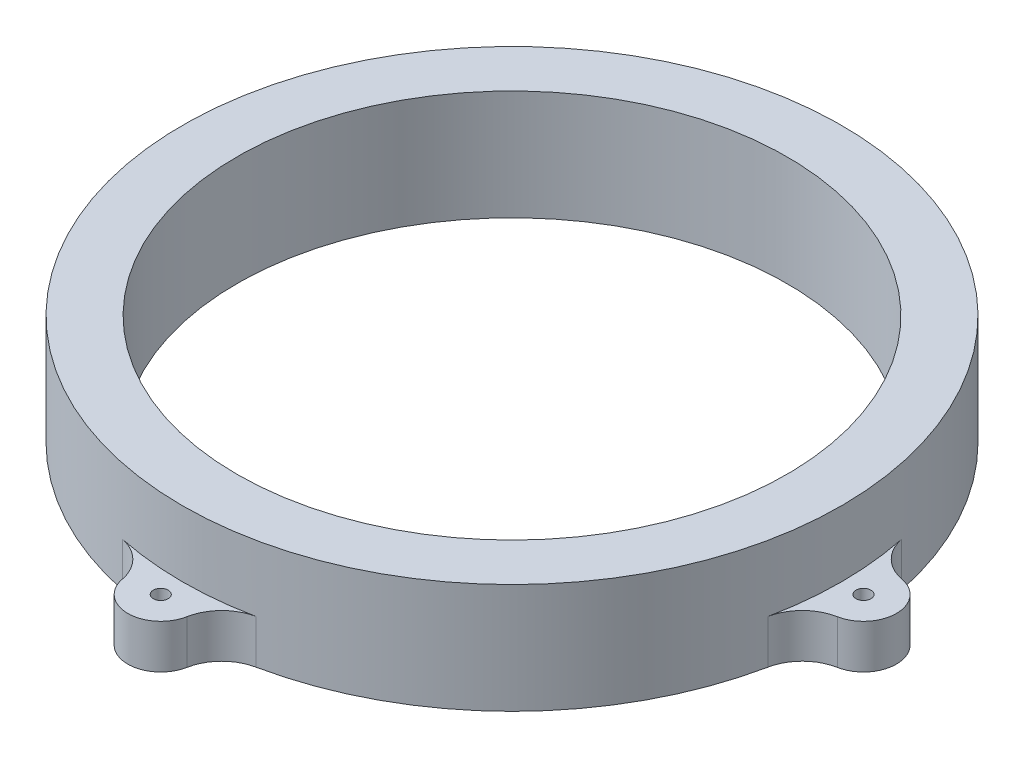
ISO-10303-21;
HEADER;
FILE_DESCRIPTION(('STEP AP214'),'2;1');
FILE_NAME('part.step','',(''),(''),'','','');
FILE_SCHEMA(('AUTOMOTIVE_DESIGN { 1 0 10303 214 1 1 1 1 }'));
ENDSEC;
DATA;
#1=APPLICATION_CONTEXT('core data for automotive mechanical design processes');
#2=APPLICATION_PROTOCOL_DEFINITION('international standard','automotive_design',2000,#1);
#3=PRODUCT_CONTEXT('',#1,'mechanical');
#4=PRODUCT('Part','Part','',(#3));
#5=PRODUCT_RELATED_PRODUCT_CATEGORY('part','',(#4));
#6=PRODUCT_DEFINITION_FORMATION('','',#4);
#7=PRODUCT_DEFINITION_CONTEXT('part definition',#1,'design');
#8=PRODUCT_DEFINITION('design','',#6,#7);
#9=PRODUCT_DEFINITION_SHAPE('','',#8);
#10=(LENGTH_UNIT() NAMED_UNIT(*) SI_UNIT(.MILLI.,.METRE.));
#11=(NAMED_UNIT(*) PLANE_ANGLE_UNIT() SI_UNIT($,.RADIAN.));
#12=(NAMED_UNIT(*) SI_UNIT($,.STERADIAN.) SOLID_ANGLE_UNIT());
#13=UNCERTAINTY_MEASURE_WITH_UNIT(LENGTH_MEASURE(1.E-05),#10,'distance_accuracy_value','');
#14=(GEOMETRIC_REPRESENTATION_CONTEXT(3) GLOBAL_UNCERTAINTY_ASSIGNED_CONTEXT((#13)) GLOBAL_UNIT_ASSIGNED_CONTEXT((#10,
#11,#12)) REPRESENTATION_CONTEXT('',''));
#15=CARTESIAN_POINT('',(0.,0.,0.));
#16=DIRECTION('',(0.,0.,1.));
#17=DIRECTION('',(1.,0.,0.));
#18=AXIS2_PLACEMENT_3D('',#15,#16,#17);
#19=CARTESIAN_POINT('',(0.,10.,0.));
#20=DIRECTION('',(0.,1.,0.));
#21=DIRECTION('',(0.,0.,1.));
#22=AXIS2_PLACEMENT_3D('',#19,#20,#21);
#23=PLANE('',#22);
#24=CARTESIAN_POINT('',(0.,10.,0.));
#25=DIRECTION('',(0.,1.,0.));
#26=DIRECTION('',(0.,0.,1.));
#27=AXIS2_PLACEMENT_3D('',#24,#25,#26);
#28=CIRCLE('',#27,75.);
#29=CARTESIAN_POINT('',(73.454443100662,10.,15.1474350558638));
#30=VERTEX_POINT('',#29);
#31=CARTESIAN_POINT('',(73.445265130853,10.,-15.1918738099914));
#32=VERTEX_POINT('',#31);
#33=EDGE_CURVE('E12',#30,#32,#28,.T.);
#34=ORIENTED_EDGE('',*,*,#33,.F.);
#35=CARTESIAN_POINT('',(83.2483688474169,10.,17.1670930633123));
#36=DIRECTION('',(0.,1.,0.));
#37=DIRECTION('',(0.,0.,1.));
#38=AXIS2_PLACEMENT_3D('',#35,#36,#37);
#39=CIRCLE('',#38,10.);
#40=CARTESIAN_POINT('',(81.3783331926721,10.,7.34350071377011));
#41=VERTEX_POINT('',#40);
#42=EDGE_CURVE('E400',#30,#41,#39,.F.);
#43=ORIENTED_EDGE('',*,*,#42,.T.);
#44=CARTESIAN_POINT('',(79.9758064516135,10.,-0.0241935483865136));
#45=DIRECTION('',(0.,1.,0.));
#46=DIRECTION('',(0.,0.,1.));
#47=AXIS2_PLACEMENT_3D('',#44,#45,#46);
#48=CIRCLE('',#47,7.50000000000001);
#49=CARTESIAN_POINT('',(81.3738753216221,10.,-7.39273502107384));
#50=VERTEX_POINT('',#49);
#51=EDGE_CURVE('E276',#41,#50,#48,.T.);
#52=ORIENTED_EDGE('',*,*,#51,.T.);
#53=CARTESIAN_POINT('',(83.2379671483001,10.,-17.2174569846569));
#54=DIRECTION('',(0.,1.,0.));
#55=DIRECTION('',(0.,0.,1.));
#56=AXIS2_PLACEMENT_3D('',#53,#54,#55);
#57=CIRCLE('',#56,10.);
#58=EDGE_CURVE('E403',#50,#32,#57,.F.);
#59=ORIENTED_EDGE('',*,*,#58,.T.);
#60=EDGE_LOOP('',(#34,#43,#52,#59));
#61=FACE_BOUND('',#60,.T.);
#62=CARTESIAN_POINT('',(79.9758064516135,10.,-0.0241935483865136));
#63=DIRECTION('',(0.,1.,0.));
#64=DIRECTION('',(0.,0.,1.));
#65=AXIS2_PLACEMENT_3D('',#62,#63,#64);
#66=CIRCLE('',#65,1.7);
#67=CARTESIAN_POINT('',(79.9758064516135,10.,1.67580645161349));
#68=VERTEX_POINT('',#67);
#69=EDGE_CURVE('E282',#68,#68,#66,.T.);
#70=ORIENTED_EDGE('',*,*,#69,.F.);
#71=EDGE_LOOP('',(#70));
#72=FACE_BOUND('',#71,.T.);
#73=ADVANCED_FACE('F96',(#61,#72),#23,.T.);
#74=CARTESIAN_POINT('',(15.1738597330543,10.,-73.4489889705883));
#75=VERTEX_POINT('',#74);
#76=CARTESIAN_POINT('',(-15.1738597330543,10.,-73.4489889705883));
#77=VERTEX_POINT('',#76);
#78=EDGE_CURVE('E106',#75,#77,#28,.T.);
#79=ORIENTED_EDGE('',*,*,#78,.F.);
#80=CARTESIAN_POINT('',(17.1970410307949,10.,-83.2421875));
#81=DIRECTION('',(0.,1.,0.));
#82=DIRECTION('',(0.,0.,1.));
#83=AXIS2_PLACEMENT_3D('',#80,#81,#82);
#84=CIRCLE('',#83,10.);
#85=CARTESIAN_POINT('',(7.37016044176925,10.,-81.3895089285714));
#86=VERTEX_POINT('',#85);
#87=EDGE_CURVE('E100',#75,#86,#84,.F.);
#88=ORIENTED_EDGE('',*,*,#87,.T.);
#89=CARTESIAN_POINT('',(0.,10.,-80.));
#90=DIRECTION('',(0.,1.,0.));
#91=DIRECTION('',(0.,0.,1.));
#92=AXIS2_PLACEMENT_3D('',#89,#90,#91);
#93=CIRCLE('',#92,7.5);
#94=CARTESIAN_POINT('',(-7.37016044176925,10.,-81.3895089285714));
#95=VERTEX_POINT('',#94);
#96=EDGE_CURVE('E260',#86,#95,#93,.T.);
#97=ORIENTED_EDGE('',*,*,#96,.T.);
#98=CARTESIAN_POINT('',(-17.1970410307949,10.,-83.2421875));
#99=DIRECTION('',(0.,1.,0.));
#100=DIRECTION('',(0.,0.,1.));
#101=AXIS2_PLACEMENT_3D('',#98,#99,#100);
#102=CIRCLE('',#101,10.);
#103=EDGE_CURVE('E409',#95,#77,#102,.F.);
#104=ORIENTED_EDGE('',*,*,#103,.T.);
#105=EDGE_LOOP('',(#79,#88,#97,#104));
#106=FACE_BOUND('',#105,.T.);
#107=CARTESIAN_POINT('',(0.,10.,-80.));
#108=DIRECTION('',(0.,1.,0.));
#109=DIRECTION('',(0.,0.,1.));
#110=AXIS2_PLACEMENT_3D('',#107,#108,#109);
#111=CIRCLE('',#110,1.69999999999999);
#112=CARTESIAN_POINT('',(0.,10.,-78.3));
#113=VERTEX_POINT('',#112);
#114=EDGE_CURVE('E267',#113,#113,#111,.T.);
#115=ORIENTED_EDGE('',*,*,#114,.F.);
#116=EDGE_LOOP('',(#115));
#117=FACE_BOUND('',#116,.T.);
#118=ADVANCED_FACE('F423',(#106,#117),#23,.T.);
#119=CARTESIAN_POINT('',(-73.445265130853,10.,-15.1918738099914));
#120=VERTEX_POINT('',#119);
#121=CARTESIAN_POINT('',(-73.454443100662,10.,15.1474350558638));
#122=VERTEX_POINT('',#121);
#123=EDGE_CURVE('E247',#120,#122,#28,.T.);
#124=ORIENTED_EDGE('',*,*,#123,.F.);
#125=CARTESIAN_POINT('',(-83.2379671483001,10.,-17.2174569846569));
#126=DIRECTION('',(0.,1.,0.));
#127=DIRECTION('',(0.,0.,1.));
#128=AXIS2_PLACEMENT_3D('',#125,#126,#127);
#129=CIRCLE('',#128,10.);
#130=CARTESIAN_POINT('',(-81.3738753216221,10.,-7.39273502107383));
#131=VERTEX_POINT('',#130);
#132=EDGE_CURVE('E381',#120,#131,#129,.F.);
#133=ORIENTED_EDGE('',*,*,#132,.T.);
#134=CARTESIAN_POINT('',(-79.9758064516135,10.,-0.0241935483865081));
#135=DIRECTION('',(0.,1.,0.));
#136=DIRECTION('',(0.,0.,1.));
#137=AXIS2_PLACEMENT_3D('',#134,#135,#136);
#138=CIRCLE('',#137,7.5);
#139=CARTESIAN_POINT('',(-81.3783331926721,10.,7.34350071377011));
#140=VERTEX_POINT('',#139);
#141=EDGE_CURVE('E306',#131,#140,#138,.T.);
#142=ORIENTED_EDGE('',*,*,#141,.T.);
#143=CARTESIAN_POINT('',(-83.2483688474169,10.,17.1670930633123));
#144=DIRECTION('',(0.,1.,0.));
#145=DIRECTION('',(0.,0.,1.));
#146=AXIS2_PLACEMENT_3D('',#143,#144,#145);
#147=CIRCLE('',#146,10.);
#148=EDGE_CURVE('E384',#140,#122,#147,.F.);
#149=ORIENTED_EDGE('',*,*,#148,.T.);
#150=EDGE_LOOP('',(#124,#133,#142,#149));
#151=FACE_BOUND('',#150,.T.);
#152=CARTESIAN_POINT('',(-79.9758064516135,10.,-0.0241935483865081));
#153=DIRECTION('',(0.,1.,0.));
#154=DIRECTION('',(0.,0.,1.));
#155=AXIS2_PLACEMENT_3D('',#152,#153,#154);
#156=CIRCLE('',#155,1.7);
#157=CARTESIAN_POINT('',(-79.9758064516135,10.,1.67580645161349));
#158=VERTEX_POINT('',#157);
#159=EDGE_CURVE('E312',#158,#158,#156,.T.);
#160=ORIENTED_EDGE('',*,*,#159,.F.);
#161=EDGE_LOOP('',(#160));
#162=FACE_BOUND('',#161,.T.);
#163=ADVANCED_FACE('F465',(#151,#162),#23,.T.);
#164=CARTESIAN_POINT('',(0.,10.,0.));
#165=DIRECTION('',(0.,-1.,0.));
#166=DIRECTION('',(0.,0.,-1.));
#167=AXIS2_PLACEMENT_3D('',#164,#165,#166);
#168=CYLINDRICAL_SURFACE('',#167,62.6);
#169=CARTESIAN_POINT('',(0.,0.,0.));
#170=DIRECTION('',(0.,1.,0.));
#171=DIRECTION('',(0.,0.,1.));
#172=AXIS2_PLACEMENT_3D('',#169,#170,#171);
#173=CIRCLE('',#172,62.6);
#174=CARTESIAN_POINT('',(0.,0.,62.6));
#175=VERTEX_POINT('',#174);
#176=EDGE_CURVE('E255',#175,#175,#173,.T.);
#177=ORIENTED_EDGE('',*,*,#176,.F.);
#178=EDGE_LOOP('',(#177));
#179=FACE_BOUND('',#178,.T.);
#180=CARTESIAN_POINT('',(0.,25.,0.));
#181=DIRECTION('',(0.,1.,0.));
#182=DIRECTION('',(0.,0.,1.));
#183=AXIS2_PLACEMENT_3D('',#180,#181,#182);
#184=CIRCLE('',#183,62.6);
#185=CARTESIAN_POINT('',(0.,25.,62.6));
#186=VERTEX_POINT('',#185);
#187=EDGE_CURVE('E739',#186,#186,#184,.T.);
#188=ORIENTED_EDGE('',*,*,#187,.T.);
#189=EDGE_LOOP('',(#188));
#190=FACE_BOUND('',#189,.T.);
#191=ADVANCED_FACE('F476',(#179,#190),#168,.F.);
#192=CARTESIAN_POINT('',(0.,0.,0.));
#193=DIRECTION('',(0.,1.,0.));
#194=DIRECTION('',(0.,0.,1.));
#195=AXIS2_PLACEMENT_3D('',#192,#193,#194);
#196=PLANE('',#195);
#197=CARTESIAN_POINT('',(0.,0.,0.));
#198=DIRECTION('',(0.,1.,0.));
#199=DIRECTION('',(0.,0.,1.));
#200=AXIS2_PLACEMENT_3D('',#197,#198,#199);
#201=CIRCLE('',#200,75.);
#202=CARTESIAN_POINT('',(-15.1738597330543,0.,-73.4489889705883));
#203=VERTEX_POINT('',#202);
#204=CARTESIAN_POINT('',(-73.445265130853,0.,-15.1918738099914));
#205=VERTEX_POINT('',#204);
#206=EDGE_CURVE('E266',#203,#205,#201,.T.);
#207=ORIENTED_EDGE('',*,*,#206,.F.);
#208=CARTESIAN_POINT('',(-17.1970410307949,0.,-83.2421875));
#209=DIRECTION('',(0.,1.,0.));
#210=DIRECTION('',(0.,0.,1.));
#211=AXIS2_PLACEMENT_3D('',#208,#209,#210);
#212=CIRCLE('',#211,10.);
#213=CARTESIAN_POINT('',(-7.37016044176925,0.,-81.3895089285714));
#214=VERTEX_POINT('',#213);
#215=EDGE_CURVE('E115',#203,#214,#212,.T.);
#216=ORIENTED_EDGE('',*,*,#215,.T.);
#217=CARTESIAN_POINT('',(0.,0.,-80.));
#218=DIRECTION('',(0.,1.,0.));
#219=DIRECTION('',(0.,0.,1.));
#220=AXIS2_PLACEMENT_3D('',#217,#218,#219);
#221=CIRCLE('',#220,7.5);
#222=CARTESIAN_POINT('',(7.37016044176925,0.,-81.3895089285714));
#223=VERTEX_POINT('',#222);
#224=EDGE_CURVE('E271',#223,#214,#221,.T.);
#225=ORIENTED_EDGE('',*,*,#224,.F.);
#226=CARTESIAN_POINT('',(17.1970410307949,0.,-83.2421875));
#227=DIRECTION('',(0.,1.,0.));
#228=DIRECTION('',(0.,0.,1.));
#229=AXIS2_PLACEMENT_3D('',#226,#227,#228);
#230=CIRCLE('',#229,10.);
#231=CARTESIAN_POINT('',(15.1738597330543,0.,-73.4489889705883));
#232=VERTEX_POINT('',#231);
#233=EDGE_CURVE('E123',#223,#232,#230,.T.);
#234=ORIENTED_EDGE('',*,*,#233,.T.);
#235=CARTESIAN_POINT('',(73.445265130853,0.,-15.1918738099914));
#236=VERTEX_POINT('',#235);
#237=EDGE_CURVE('E261',#236,#232,#201,.T.);
#238=ORIENTED_EDGE('',*,*,#237,.F.);
#239=CARTESIAN_POINT('',(83.2379671483001,0.,-17.2174569846569));
#240=DIRECTION('',(0.,1.,0.));
#241=DIRECTION('',(0.,0.,1.));
#242=AXIS2_PLACEMENT_3D('',#239,#240,#241);
#243=CIRCLE('',#242,10.);
#244=CARTESIAN_POINT('',(81.3738753216221,0.,-7.39273502107384));
#245=VERTEX_POINT('',#244);
#246=EDGE_CURVE('E406',#236,#245,#243,.T.);
#247=ORIENTED_EDGE('',*,*,#246,.T.);
#248=CARTESIAN_POINT('',(79.9758064516135,0.,-0.0241935483865136));
#249=DIRECTION('',(0.,1.,0.));
#250=DIRECTION('',(0.,0.,1.));
#251=AXIS2_PLACEMENT_3D('',#248,#249,#250);
#252=CIRCLE('',#251,7.50000000000001);
#253=CARTESIAN_POINT('',(81.3783331926721,0.,7.34350071377011));
#254=VERTEX_POINT('',#253);
#255=EDGE_CURVE('E286',#254,#245,#252,.T.);
#256=ORIENTED_EDGE('',*,*,#255,.F.);
#257=CARTESIAN_POINT('',(83.2483688474169,0.,17.1670930633123));
#258=DIRECTION('',(0.,1.,0.));
#259=DIRECTION('',(0.,0.,1.));
#260=AXIS2_PLACEMENT_3D('',#257,#258,#259);
#261=CIRCLE('',#260,10.);
#262=CARTESIAN_POINT('',(73.454443100662,0.,15.1474350558638));
#263=VERTEX_POINT('',#262);
#264=EDGE_CURVE('E397',#254,#263,#261,.T.);
#265=ORIENTED_EDGE('',*,*,#264,.T.);
#266=CARTESIAN_POINT('',(15.1654141952169,0.,73.4507332317896));
#267=VERTEX_POINT('',#266);
#268=EDGE_CURVE('E265',#267,#263,#201,.T.);
#269=ORIENTED_EDGE('',*,*,#268,.F.);
#270=CARTESIAN_POINT('',(17.1874694212458,0.,83.2441643293615));
#271=DIRECTION('',(0.,1.,0.));
#272=DIRECTION('',(0.,0.,1.));
#273=AXIS2_PLACEMENT_3D('',#270,#271,#272);
#274=CIRCLE('',#273,10.);
#275=CARTESIAN_POINT('',(7.36605832339106,0.,81.3627063715704));
#276=VERTEX_POINT('',#275);
#277=EDGE_CURVE('E221',#267,#276,#274,.T.);
#278=ORIENTED_EDGE('',*,*,#277,.T.);
#279=CARTESIAN_POINT('',(0.,0.,79.951612903227));
#280=DIRECTION('',(0.,1.,0.));
#281=DIRECTION('',(0.,0.,1.));
#282=AXIS2_PLACEMENT_3D('',#279,#280,#281);
#283=CIRCLE('',#282,7.5);
#284=CARTESIAN_POINT('',(-7.36605832339106,0.,81.3627063715704));
#285=VERTEX_POINT('',#284);
#286=EDGE_CURVE('E301',#285,#276,#283,.T.);
#287=ORIENTED_EDGE('',*,*,#286,.F.);
#288=CARTESIAN_POINT('',(-17.1874694212458,0.,83.2441643293615));
#289=DIRECTION('',(0.,1.,0.));
#290=DIRECTION('',(0.,0.,1.));
#291=AXIS2_PLACEMENT_3D('',#288,#289,#290);
#292=CIRCLE('',#291,10.);
#293=CARTESIAN_POINT('',(-15.1654141952169,0.,73.4507332317896));
#294=VERTEX_POINT('',#293);
#295=EDGE_CURVE('E390',#285,#294,#292,.T.);
#296=ORIENTED_EDGE('',*,*,#295,.T.);
#297=CARTESIAN_POINT('',(-73.454443100662,0.,15.1474350558638));
#298=VERTEX_POINT('',#297);
#299=EDGE_CURVE('E259',#298,#294,#201,.T.);
#300=ORIENTED_EDGE('',*,*,#299,.F.);
#301=CARTESIAN_POINT('',(-83.2483688474169,0.,17.1670930633123));
#302=DIRECTION('',(0.,1.,0.));
#303=DIRECTION('',(0.,0.,1.));
#304=AXIS2_PLACEMENT_3D('',#301,#302,#303);
#305=CIRCLE('',#304,10.);
#306=CARTESIAN_POINT('',(-81.3783331926721,0.,7.34350071377011));
#307=VERTEX_POINT('',#306);
#308=EDGE_CURVE('E387',#298,#307,#305,.T.);
#309=ORIENTED_EDGE('',*,*,#308,.T.);
#310=CARTESIAN_POINT('',(-79.9758064516135,0.,-0.0241935483865081));
#311=DIRECTION('',(0.,1.,0.));
#312=DIRECTION('',(0.,0.,1.));
#313=AXIS2_PLACEMENT_3D('',#310,#311,#312);
#314=CIRCLE('',#313,7.5);
#315=CARTESIAN_POINT('',(-81.3738753216221,0.,-7.39273502107383));
#316=VERTEX_POINT('',#315);
#317=EDGE_CURVE('E316',#316,#307,#314,.T.);
#318=ORIENTED_EDGE('',*,*,#317,.F.);
#319=CARTESIAN_POINT('',(-83.2379671483001,0.,-17.2174569846569));
#320=DIRECTION('',(0.,1.,0.));
#321=DIRECTION('',(0.,0.,1.));
#322=AXIS2_PLACEMENT_3D('',#319,#320,#321);
#323=CIRCLE('',#322,10.);
#324=EDGE_CURVE('E378',#316,#205,#323,.T.);
#325=ORIENTED_EDGE('',*,*,#324,.T.);
#326=EDGE_LOOP('',(#207,#216,#225,#234,#238,#247,#256,#265,#269,#278,#287,#296,#300,#309,#318,#325));
#327=FACE_BOUND('',#326,.T.);
#328=ORIENTED_EDGE('',*,*,#176,.T.);
#329=EDGE_LOOP('',(#328));
#330=FACE_BOUND('',#329,.T.);
#331=CARTESIAN_POINT('',(79.9758064516135,0.,-0.0241935483865136));
#332=DIRECTION('',(0.,1.,0.));
#333=DIRECTION('',(0.,0.,1.));
#334=AXIS2_PLACEMENT_3D('',#331,#332,#333);
#335=CIRCLE('',#334,1.7);
#336=CARTESIAN_POINT('',(79.9758064516135,0.,1.67580645161349));
#337=VERTEX_POINT('',#336);
#338=EDGE_CURVE('E287',#337,#337,#335,.T.);
#339=ORIENTED_EDGE('',*,*,#338,.T.);
#340=EDGE_LOOP('',(#339));
#341=FACE_BOUND('',#340,.T.);
#342=CARTESIAN_POINT('',(0.,0.,-80.));
#343=DIRECTION('',(0.,1.,0.));
#344=DIRECTION('',(0.,0.,1.));
#345=AXIS2_PLACEMENT_3D('',#342,#343,#344);
#346=CIRCLE('',#345,1.69999999999999);
#347=CARTESIAN_POINT('',(0.,0.,-78.3));
#348=VERTEX_POINT('',#347);
#349=EDGE_CURVE('E272',#348,#348,#346,.T.);
#350=ORIENTED_EDGE('',*,*,#349,.T.);
#351=EDGE_LOOP('',(#350));
#352=FACE_BOUND('',#351,.T.);
#353=CARTESIAN_POINT('',(-79.9758064516135,0.,-0.0241935483865081));
#354=DIRECTION('',(0.,1.,0.));
#355=DIRECTION('',(0.,0.,1.));
#356=AXIS2_PLACEMENT_3D('',#353,#354,#355);
#357=CIRCLE('',#356,1.7);
#358=CARTESIAN_POINT('',(-79.9758064516135,0.,1.67580645161349));
#359=VERTEX_POINT('',#358);
#360=EDGE_CURVE('E317',#359,#359,#357,.T.);
#361=ORIENTED_EDGE('',*,*,#360,.T.);
#362=EDGE_LOOP('',(#361));
#363=FACE_BOUND('',#362,.T.);
#364=CARTESIAN_POINT('',(0.,0.,79.951612903227));
#365=DIRECTION('',(0.,1.,0.));
#366=DIRECTION('',(0.,0.,1.));
#367=AXIS2_PLACEMENT_3D('',#364,#365,#366);
#368=CIRCLE('',#367,1.7000000000002);
#369=CARTESIAN_POINT('',(0.,0.,81.6516129032272));
#370=VERTEX_POINT('',#369);
#371=EDGE_CURVE('E302',#370,#370,#368,.T.);
#372=ORIENTED_EDGE('',*,*,#371,.T.);
#373=EDGE_LOOP('',(#372));
#374=FACE_BOUND('',#373,.T.);
#375=ADVANCED_FACE('F415',(#327,#330,#341,#352,#363,#374),#196,.F.);
#376=CARTESIAN_POINT('',(-15.1654141952169,10.,73.4507332317896));
#377=VERTEX_POINT('',#376);
#378=CARTESIAN_POINT('',(15.1654141952169,10.,73.4507332317896));
#379=VERTEX_POINT('',#378);
#380=EDGE_CURVE('E108',#377,#379,#28,.T.);
#381=ORIENTED_EDGE('',*,*,#380,.F.);
#382=CARTESIAN_POINT('',(-17.1874694212458,10.,83.2441643293615));
#383=DIRECTION('',(0.,1.,0.));
#384=DIRECTION('',(0.,0.,1.));
#385=AXIS2_PLACEMENT_3D('',#382,#383,#384);
#386=CIRCLE('',#385,10.);
#387=CARTESIAN_POINT('',(-7.36605832339106,10.,81.3627063715704));
#388=VERTEX_POINT('',#387);
#389=EDGE_CURVE('E238',#377,#388,#386,.F.);
#390=ORIENTED_EDGE('',*,*,#389,.T.);
#391=CARTESIAN_POINT('',(0.,10.,79.951612903227));
#392=DIRECTION('',(0.,1.,0.));
#393=DIRECTION('',(0.,0.,1.));
#394=AXIS2_PLACEMENT_3D('',#391,#392,#393);
#395=CIRCLE('',#394,7.5);
#396=CARTESIAN_POINT('',(7.36605832339106,10.,81.3627063715704));
#397=VERTEX_POINT('',#396);
#398=EDGE_CURVE('E236',#388,#397,#395,.T.);
#399=ORIENTED_EDGE('',*,*,#398,.T.);
#400=CARTESIAN_POINT('',(17.1874694212458,10.,83.2441643293615));
#401=DIRECTION('',(0.,1.,0.));
#402=DIRECTION('',(0.,0.,1.));
#403=AXIS2_PLACEMENT_3D('',#400,#401,#402);
#404=CIRCLE('',#403,10.);
#405=EDGE_CURVE('E219',#397,#379,#404,.F.);
#406=ORIENTED_EDGE('',*,*,#405,.T.);
#407=EDGE_LOOP('',(#381,#390,#399,#406));
#408=FACE_BOUND('',#407,.T.);
#409=CARTESIAN_POINT('',(0.,10.,79.951612903227));
#410=DIRECTION('',(0.,1.,0.));
#411=DIRECTION('',(0.,0.,1.));
#412=AXIS2_PLACEMENT_3D('',#409,#410,#411);
#413=CIRCLE('',#412,1.7000000000002);
#414=CARTESIAN_POINT('',(0.,10.,81.6516129032272));
#415=VERTEX_POINT('',#414);
#416=EDGE_CURVE('E297',#415,#415,#413,.T.);
#417=ORIENTED_EDGE('',*,*,#416,.F.);
#418=EDGE_LOOP('',(#417));
#419=FACE_BOUND('',#418,.T.);
#420=ADVANCED_FACE('F232',(#408,#419),#23,.T.);
#421=CARTESIAN_POINT('',(0.,10.,0.));
#422=DIRECTION('',(0.,-1.,0.));
#423=DIRECTION('',(0.,0.,-1.));
#424=AXIS2_PLACEMENT_3D('',#421,#422,#423);
#425=CYLINDRICAL_SURFACE('',#424,75.);
#426=DIRECTION('',(0.,-1.,0.));
#427=VECTOR('',#426,1.);
#428=CARTESIAN_POINT('',(-15.1654141952169,10.,73.4507332317896));
#429=LINE('',#428,#427);
#430=EDGE_CURVE('E244',#294,#377,#429,.F.);
#431=ORIENTED_EDGE('',*,*,#430,.T.);
#432=ORIENTED_EDGE('',*,*,#380,.T.);
#433=DIRECTION('',(0.,-1.,0.));
#434=VECTOR('',#433,1.);
#435=CARTESIAN_POINT('',(15.1654141952169,10.,73.4507332317896));
#436=LINE('',#435,#434);
#437=EDGE_CURVE('E215',#379,#267,#436,.T.);
#438=ORIENTED_EDGE('',*,*,#437,.T.);
#439=ORIENTED_EDGE('',*,*,#268,.T.);
#440=DIRECTION('',(0.,-1.,0.));
#441=VECTOR('',#440,1.);
#442=CARTESIAN_POINT('',(73.454443100662,10.,15.1474350558638));
#443=LINE('',#442,#441);
#444=EDGE_CURVE('E228',#263,#30,#443,.F.);
#445=ORIENTED_EDGE('',*,*,#444,.T.);
#446=ORIENTED_EDGE('',*,*,#33,.T.);
#447=DIRECTION('',(0.,-1.,0.));
#448=VECTOR('',#447,1.);
#449=CARTESIAN_POINT('',(73.4452651308531,10.,-15.1918738099914));
#450=LINE('',#449,#448);
#451=EDGE_CURVE('E368',#32,#236,#450,.T.);
#452=ORIENTED_EDGE('',*,*,#451,.T.);
#453=ORIENTED_EDGE('',*,*,#237,.T.);
#454=DIRECTION('',(0.,-1.,0.));
#455=VECTOR('',#454,1.);
#456=CARTESIAN_POINT('',(15.1738597330543,10.,-73.4489889705883));
#457=LINE('',#456,#455);
#458=EDGE_CURVE('E364',#232,#75,#457,.F.);
#459=ORIENTED_EDGE('',*,*,#458,.T.);
#460=ORIENTED_EDGE('',*,*,#78,.T.);
#461=DIRECTION('',(0.,-1.,0.));
#462=VECTOR('',#461,1.);
#463=CARTESIAN_POINT('',(-15.1738597330543,10.,-73.4489889705883));
#464=LINE('',#463,#462);
#465=EDGE_CURVE('E335',#77,#203,#464,.T.);
#466=ORIENTED_EDGE('',*,*,#465,.T.);
#467=ORIENTED_EDGE('',*,*,#206,.T.);
#468=DIRECTION('',(0.,-1.,0.));
#469=VECTOR('',#468,1.);
#470=CARTESIAN_POINT('',(-73.4452651308531,10.,-15.1918738099914));
#471=LINE('',#470,#469);
#472=EDGE_CURVE('E338',#205,#120,#471,.F.);
#473=ORIENTED_EDGE('',*,*,#472,.T.);
#474=ORIENTED_EDGE('',*,*,#123,.T.);
#475=DIRECTION('',(0.,-1.,0.));
#476=VECTOR('',#475,1.);
#477=CARTESIAN_POINT('',(-73.454443100662,10.,15.1474350558638));
#478=LINE('',#477,#476);
#479=EDGE_CURVE('E344',#122,#298,#478,.T.);
#480=ORIENTED_EDGE('',*,*,#479,.T.);
#481=ORIENTED_EDGE('',*,*,#299,.T.);
#482=EDGE_LOOP('',(#431,#432,#438,#439,#445,#446,#452,#453,#459,#460,#466,#467,#473,#474,#480,#481));
#483=FACE_BOUND('',#482,.T.);
#484=CARTESIAN_POINT('',(0.,25.,0.));
#485=DIRECTION('',(0.,1.,0.));
#486=DIRECTION('',(0.,0.,1.));
#487=AXIS2_PLACEMENT_3D('',#484,#485,#486);
#488=CIRCLE('',#487,75.);
#489=CARTESIAN_POINT('',(0.,25.,75.));
#490=VERTEX_POINT('',#489);
#491=EDGE_CURVE('E253',#490,#490,#488,.T.);
#492=ORIENTED_EDGE('',*,*,#491,.F.);
#493=EDGE_LOOP('',(#492));
#494=FACE_BOUND('',#493,.T.);
#495=ADVANCED_FACE('F240',(#483,#494),#425,.T.);
#496=CARTESIAN_POINT('',(0.,10.,-80.));
#497=DIRECTION('',(0.,-1.,0.));
#498=DIRECTION('',(0.,0.,-1.));
#499=AXIS2_PLACEMENT_3D('',#496,#497,#498);
#500=CYLINDRICAL_SURFACE('',#499,1.69999999999999);
#501=ORIENTED_EDGE('',*,*,#114,.T.);
#502=EDGE_LOOP('',(#501));
#503=FACE_BOUND('',#502,.T.);
#504=ORIENTED_EDGE('',*,*,#349,.F.);
#505=EDGE_LOOP('',(#504));
#506=FACE_BOUND('',#505,.T.);
#507=ADVANCED_FACE('F473',(#503,#506),#500,.F.);
#508=CARTESIAN_POINT('',(0.,10.,-80.));
#509=DIRECTION('',(0.,-1.,0.));
#510=DIRECTION('',(0.,0.,-1.));
#511=AXIS2_PLACEMENT_3D('',#508,#509,#510);
#512=CYLINDRICAL_SURFACE('',#511,7.5);
#513=ORIENTED_EDGE('',*,*,#224,.T.);
#514=DIRECTION('',(0.,-1.,0.));
#515=VECTOR('',#514,1.);
#516=CARTESIAN_POINT('',(-7.37016044176925,10.,-81.3895089285714));
#517=LINE('',#516,#515);
#518=EDGE_CURVE('E374',#214,#95,#517,.F.);
#519=ORIENTED_EDGE('',*,*,#518,.T.);
#520=ORIENTED_EDGE('',*,*,#96,.F.);
#521=DIRECTION('',(0.,-1.,0.));
#522=VECTOR('',#521,1.);
#523=CARTESIAN_POINT('',(7.37016044176925,10.,-81.3895089285714));
#524=LINE('',#523,#522);
#525=EDGE_CURVE('E371',#86,#223,#524,.T.);
#526=ORIENTED_EDGE('',*,*,#525,.T.);
#527=EDGE_LOOP('',(#513,#519,#520,#526));
#528=FACE_BOUND('',#527,.T.);
#529=ADVANCED_FACE('F426',(#528),#512,.T.);
#530=CARTESIAN_POINT('',(79.9758064516135,10.,-0.0241935483865136));
#531=DIRECTION('',(0.,-1.,0.));
#532=DIRECTION('',(0.,0.,-1.));
#533=AXIS2_PLACEMENT_3D('',#530,#531,#532);
#534=CYLINDRICAL_SURFACE('',#533,1.7);
#535=ORIENTED_EDGE('',*,*,#69,.T.);
#536=EDGE_LOOP('',(#535));
#537=FACE_BOUND('',#536,.T.);
#538=ORIENTED_EDGE('',*,*,#338,.F.);
#539=EDGE_LOOP('',(#538));
#540=FACE_BOUND('',#539,.T.);
#541=ADVANCED_FACE('F499',(#537,#540),#534,.F.);
#542=CARTESIAN_POINT('',(79.9758064516135,10.,-0.0241935483865136));
#543=DIRECTION('',(0.,-1.,0.));
#544=DIRECTION('',(0.,0.,-1.));
#545=AXIS2_PLACEMENT_3D('',#542,#543,#544);
#546=CYLINDRICAL_SURFACE('',#545,7.50000000000001);
#547=ORIENTED_EDGE('',*,*,#51,.F.);
#548=DIRECTION('',(0.,-1.,0.));
#549=VECTOR('',#548,1.);
#550=CARTESIAN_POINT('',(81.3783331926721,10.,7.34350071377011));
#551=LINE('',#550,#549);
#552=EDGE_CURVE('E360',#41,#254,#551,.T.);
#553=ORIENTED_EDGE('',*,*,#552,.T.);
#554=ORIENTED_EDGE('',*,*,#255,.T.);
#555=DIRECTION('',(0.,-1.,0.));
#556=VECTOR('',#555,1.);
#557=CARTESIAN_POINT('',(81.3738753216221,10.,-7.39273502107384));
#558=LINE('',#557,#556);
#559=EDGE_CURVE('E227',#245,#50,#558,.F.);
#560=ORIENTED_EDGE('',*,*,#559,.T.);
#561=EDGE_LOOP('',(#547,#553,#554,#560));
#562=FACE_BOUND('',#561,.T.);
#563=ADVANCED_FACE('F448',(#562),#546,.T.);
#564=CARTESIAN_POINT('',(0.,10.,79.951612903227));
#565=DIRECTION('',(0.,-1.,0.));
#566=DIRECTION('',(0.,0.,-1.));
#567=AXIS2_PLACEMENT_3D('',#564,#565,#566);
#568=CYLINDRICAL_SURFACE('',#567,1.7000000000002);
#569=ORIENTED_EDGE('',*,*,#416,.T.);
#570=EDGE_LOOP('',(#569));
#571=FACE_BOUND('',#570,.T.);
#572=ORIENTED_EDGE('',*,*,#371,.F.);
#573=EDGE_LOOP('',(#572));
#574=FACE_BOUND('',#573,.T.);
#575=ADVANCED_FACE('F475',(#571,#574),#568,.F.);
#576=CARTESIAN_POINT('',(0.,10.,79.951612903227));
#577=DIRECTION('',(0.,-1.,0.));
#578=DIRECTION('',(0.,0.,-1.));
#579=AXIS2_PLACEMENT_3D('',#576,#577,#578);
#580=CYLINDRICAL_SURFACE('',#579,7.5);
#581=ORIENTED_EDGE('',*,*,#398,.F.);
#582=DIRECTION('',(0.,-1.,0.));
#583=VECTOR('',#582,1.);
#584=CARTESIAN_POINT('',(-7.36605832339106,10.,81.3627063715704));
#585=LINE('',#584,#583);
#586=EDGE_CURVE('E350',#388,#285,#585,.T.);
#587=ORIENTED_EDGE('',*,*,#586,.T.);
#588=ORIENTED_EDGE('',*,*,#286,.T.);
#589=DIRECTION('',(0.,-1.,0.));
#590=VECTOR('',#589,1.);
#591=CARTESIAN_POINT('',(7.36605832339106,10.,81.3627063715704));
#592=LINE('',#591,#590);
#593=EDGE_CURVE('E347',#276,#397,#592,.F.);
#594=ORIENTED_EDGE('',*,*,#593,.T.);
#595=EDGE_LOOP('',(#581,#587,#588,#594));
#596=FACE_BOUND('',#595,.T.);
#597=ADVANCED_FACE('F487',(#596),#580,.T.);
#598=CARTESIAN_POINT('',(-79.9758064516135,10.,-0.0241935483865081));
#599=DIRECTION('',(0.,-1.,0.));
#600=DIRECTION('',(0.,0.,-1.));
#601=AXIS2_PLACEMENT_3D('',#598,#599,#600);
#602=CYLINDRICAL_SURFACE('',#601,1.7);
#603=ORIENTED_EDGE('',*,*,#159,.T.);
#604=EDGE_LOOP('',(#603));
#605=FACE_BOUND('',#604,.T.);
#606=ORIENTED_EDGE('',*,*,#360,.F.);
#607=EDGE_LOOP('',(#606));
#608=FACE_BOUND('',#607,.T.);
#609=ADVANCED_FACE('F479',(#605,#608),#602,.F.);
#610=CARTESIAN_POINT('',(-79.9758064516135,10.,-0.0241935483865081));
#611=DIRECTION('',(0.,-1.,0.));
#612=DIRECTION('',(0.,0.,-1.));
#613=AXIS2_PLACEMENT_3D('',#610,#611,#612);
#614=CYLINDRICAL_SURFACE('',#613,7.5);
#615=ORIENTED_EDGE('',*,*,#141,.F.);
#616=DIRECTION('',(0.,-1.,0.));
#617=VECTOR('',#616,1.);
#618=CARTESIAN_POINT('',(-81.3738753216221,10.,-7.39273502107383));
#619=LINE('',#618,#617);
#620=EDGE_CURVE('E331',#131,#316,#619,.T.);
#621=ORIENTED_EDGE('',*,*,#620,.T.);
#622=ORIENTED_EDGE('',*,*,#317,.T.);
#623=DIRECTION('',(0.,-1.,0.));
#624=VECTOR('',#623,1.);
#625=CARTESIAN_POINT('',(-81.3783331926721,10.,7.34350071377011));
#626=LINE('',#625,#624);
#627=EDGE_CURVE('E327',#307,#140,#626,.F.);
#628=ORIENTED_EDGE('',*,*,#627,.T.);
#629=EDGE_LOOP('',(#615,#621,#622,#628));
#630=FACE_BOUND('',#629,.T.);
#631=ADVANCED_FACE('F484',(#630),#614,.T.);
#632=CARTESIAN_POINT('',(-83.2379671483001,10.,-17.2174569846569));
#633=DIRECTION('',(0.,1.,0.));
#634=DIRECTION('',(0.,0.,1.));
#635=AXIS2_PLACEMENT_3D('',#632,#633,#634);
#636=CYLINDRICAL_SURFACE('',#635,10.);
#637=ORIENTED_EDGE('',*,*,#132,.F.);
#638=ORIENTED_EDGE('',*,*,#472,.F.);
#639=ORIENTED_EDGE('',*,*,#324,.F.);
#640=ORIENTED_EDGE('',*,*,#620,.F.);
#641=EDGE_LOOP('',(#637,#638,#639,#640));
#642=FACE_BOUND('',#641,.T.);
#643=ADVANCED_FACE('F494',(#642),#636,.F.);
#644=CARTESIAN_POINT('',(-83.2483688474169,10.,17.1670930633123));
#645=DIRECTION('',(0.,-1.,0.));
#646=DIRECTION('',(0.,0.,-1.));
#647=AXIS2_PLACEMENT_3D('',#644,#645,#646);
#648=CYLINDRICAL_SURFACE('',#647,10.);
#649=ORIENTED_EDGE('',*,*,#308,.F.);
#650=ORIENTED_EDGE('',*,*,#479,.F.);
#651=ORIENTED_EDGE('',*,*,#148,.F.);
#652=ORIENTED_EDGE('',*,*,#627,.F.);
#653=EDGE_LOOP('',(#649,#650,#651,#652));
#654=FACE_BOUND('',#653,.T.);
#655=ADVANCED_FACE('F505',(#654),#648,.F.);
#656=CARTESIAN_POINT('',(-17.1874694212458,10.,83.2441643293615));
#657=DIRECTION('',(0.,1.,0.));
#658=DIRECTION('',(0.,0.,1.));
#659=AXIS2_PLACEMENT_3D('',#656,#657,#658);
#660=CYLINDRICAL_SURFACE('',#659,10.);
#661=ORIENTED_EDGE('',*,*,#389,.F.);
#662=ORIENTED_EDGE('',*,*,#430,.F.);
#663=ORIENTED_EDGE('',*,*,#295,.F.);
#664=ORIENTED_EDGE('',*,*,#586,.F.);
#665=EDGE_LOOP('',(#661,#662,#663,#664));
#666=FACE_BOUND('',#665,.T.);
#667=ADVANCED_FACE('F509',(#666),#660,.F.);
#668=CARTESIAN_POINT('',(17.1874694212458,10.,83.2441643293615));
#669=DIRECTION('',(0.,-1.,0.));
#670=DIRECTION('',(0.,0.,-1.));
#671=AXIS2_PLACEMENT_3D('',#668,#669,#670);
#672=CYLINDRICAL_SURFACE('',#671,10.);
#673=ORIENTED_EDGE('',*,*,#277,.F.);
#674=ORIENTED_EDGE('',*,*,#437,.F.);
#675=ORIENTED_EDGE('',*,*,#405,.F.);
#676=ORIENTED_EDGE('',*,*,#593,.F.);
#677=EDGE_LOOP('',(#673,#674,#675,#676));
#678=FACE_BOUND('',#677,.T.);
#679=ADVANCED_FACE('F217',(#678),#672,.F.);
#680=CARTESIAN_POINT('',(83.2483688474169,10.,17.1670930633123));
#681=DIRECTION('',(0.,1.,0.));
#682=DIRECTION('',(0.,0.,1.));
#683=AXIS2_PLACEMENT_3D('',#680,#681,#682);
#684=CYLINDRICAL_SURFACE('',#683,10.);
#685=ORIENTED_EDGE('',*,*,#42,.F.);
#686=ORIENTED_EDGE('',*,*,#444,.F.);
#687=ORIENTED_EDGE('',*,*,#264,.F.);
#688=ORIENTED_EDGE('',*,*,#552,.F.);
#689=EDGE_LOOP('',(#685,#686,#687,#688));
#690=FACE_BOUND('',#689,.T.);
#691=ADVANCED_FACE('F442',(#690),#684,.F.);
#692=CARTESIAN_POINT('',(83.2379671483001,10.,-17.2174569846569));
#693=DIRECTION('',(0.,-1.,0.));
#694=DIRECTION('',(0.,0.,-1.));
#695=AXIS2_PLACEMENT_3D('',#692,#693,#694);
#696=CYLINDRICAL_SURFACE('',#695,10.);
#697=ORIENTED_EDGE('',*,*,#246,.F.);
#698=ORIENTED_EDGE('',*,*,#451,.F.);
#699=ORIENTED_EDGE('',*,*,#58,.F.);
#700=ORIENTED_EDGE('',*,*,#559,.F.);
#701=EDGE_LOOP('',(#697,#698,#699,#700));
#702=FACE_BOUND('',#701,.T.);
#703=ADVANCED_FACE('F452',(#702),#696,.F.);
#704=CARTESIAN_POINT('',(-17.1970410307949,10.,-83.2421875));
#705=DIRECTION('',(0.,-1.,0.));
#706=DIRECTION('',(0.,0.,-1.));
#707=AXIS2_PLACEMENT_3D('',#704,#705,#706);
#708=CYLINDRICAL_SURFACE('',#707,10.);
#709=ORIENTED_EDGE('',*,*,#215,.F.);
#710=ORIENTED_EDGE('',*,*,#465,.F.);
#711=ORIENTED_EDGE('',*,*,#103,.F.);
#712=ORIENTED_EDGE('',*,*,#518,.F.);
#713=EDGE_LOOP('',(#709,#710,#711,#712));
#714=FACE_BOUND('',#713,.T.);
#715=ADVANCED_FACE('F429',(#714),#708,.F.);
#716=CARTESIAN_POINT('',(17.1970410307949,10.,-83.2421875));
#717=DIRECTION('',(0.,1.,0.));
#718=DIRECTION('',(0.,0.,1.));
#719=AXIS2_PLACEMENT_3D('',#716,#717,#718);
#720=CYLINDRICAL_SURFACE('',#719,10.);
#721=ORIENTED_EDGE('',*,*,#87,.F.);
#722=ORIENTED_EDGE('',*,*,#458,.F.);
#723=ORIENTED_EDGE('',*,*,#233,.F.);
#724=ORIENTED_EDGE('',*,*,#525,.F.);
#725=EDGE_LOOP('',(#721,#722,#723,#724));
#726=FACE_BOUND('',#725,.T.);
#727=ADVANCED_FACE('F98',(#726),#720,.F.);
#728=CARTESIAN_POINT('',(0.,25.,0.));
#729=DIRECTION('',(0.,1.,0.));
#730=DIRECTION('',(0.,0.,1.));
#731=AXIS2_PLACEMENT_3D('',#728,#729,#730);
#732=PLANE('',#731);
#733=ORIENTED_EDGE('',*,*,#491,.T.);
#734=EDGE_LOOP('',(#733));
#735=FACE_BOUND('',#734,.T.);
#736=ORIENTED_EDGE('',*,*,#187,.F.);
#737=EDGE_LOOP('',(#736));
#738=FACE_BOUND('',#737,.T.);
#739=ADVANCED_FACE('F549',(#735,#738),#732,.T.);
#740=CLOSED_SHELL('',(#73,#118,#163,#191,#375,#420,#495,#507,#529,#541,#563,#575,#597,#609,#631,
#643,#655,#667,#679,#691,#703,#715,#727,#739));
#741=MANIFOLD_SOLID_BREP('B2',#740);
#742=ADVANCED_BREP_SHAPE_REPRESENTATION('',(#18,#741),#14);
#743=SHAPE_DEFINITION_REPRESENTATION(#9,#742);
ENDSEC;
END-ISO-10303-21;
